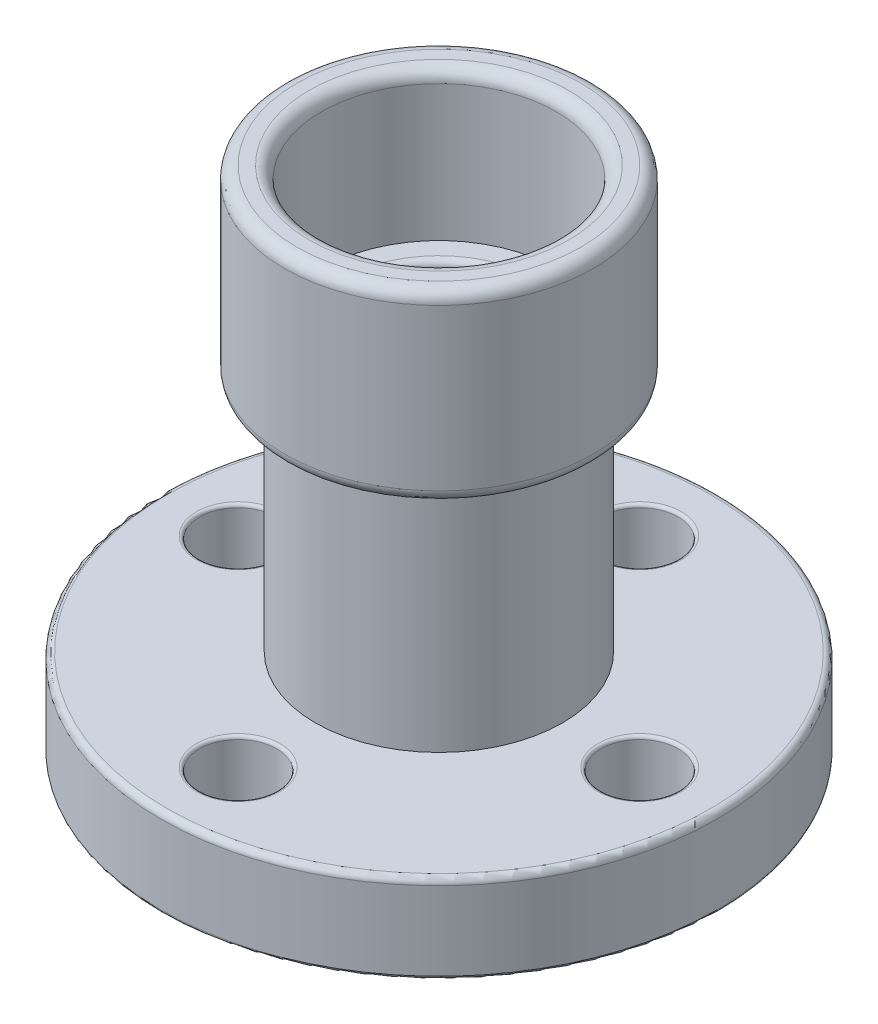
ISO-10303-21;
HEADER;
FILE_DESCRIPTION(('STEP AP214'),'2;1');
FILE_NAME('part.step','',(''),(''),'','','');
FILE_SCHEMA(('AUTOMOTIVE_DESIGN { 1 0 10303 214 1 1 1 1 }'));
ENDSEC;
DATA;
#1=APPLICATION_CONTEXT('core data for automotive mechanical design processes');
#2=APPLICATION_PROTOCOL_DEFINITION('international standard','automotive_design',2000,#1);
#3=PRODUCT_CONTEXT('',#1,'mechanical');
#4=PRODUCT('Part','Part','',(#3));
#5=PRODUCT_RELATED_PRODUCT_CATEGORY('part','',(#4));
#6=PRODUCT_DEFINITION_FORMATION('','',#4);
#7=PRODUCT_DEFINITION_CONTEXT('part definition',#1,'design');
#8=PRODUCT_DEFINITION('design','',#6,#7);
#9=PRODUCT_DEFINITION_SHAPE('','',#8);
#10=(LENGTH_UNIT() NAMED_UNIT(*) SI_UNIT(.MILLI.,.METRE.));
#11=(NAMED_UNIT(*) PLANE_ANGLE_UNIT() SI_UNIT($,.RADIAN.));
#12=(NAMED_UNIT(*) SI_UNIT($,.STERADIAN.) SOLID_ANGLE_UNIT());
#13=UNCERTAINTY_MEASURE_WITH_UNIT(LENGTH_MEASURE(1.E-05),#10,'distance_accuracy_value','');
#14=(GEOMETRIC_REPRESENTATION_CONTEXT(3) GLOBAL_UNCERTAINTY_ASSIGNED_CONTEXT((#13)) GLOBAL_UNIT_ASSIGNED_CONTEXT((#10,
#11,#12)) REPRESENTATION_CONTEXT('',''));
#15=CARTESIAN_POINT('',(0.,0.,0.));
#16=DIRECTION('',(0.,0.,1.));
#17=DIRECTION('',(1.,0.,0.));
#18=AXIS2_PLACEMENT_3D('',#15,#16,#17);
#19=CARTESIAN_POINT('',(0.,44.2,0.));
#20=DIRECTION('',(0.,1.,0.));
#21=DIRECTION('',(0.,0.,1.));
#22=AXIS2_PLACEMENT_3D('',#19,#20,#21);
#23=PLANE('',#22);
#24=CARTESIAN_POINT('',(0.,44.2,0.));
#25=DIRECTION('',(0.,1.,0.));
#26=DIRECTION('',(0.,0.,1.));
#27=AXIS2_PLACEMENT_3D('',#24,#25,#26);
#28=CIRCLE('',#27,16.);
#29=CARTESIAN_POINT('',(0.,44.2,16.));
#30=VERTEX_POINT('',#29);
#31=EDGE_CURVE('E99',#30,#30,#28,.F.);
#32=ORIENTED_EDGE('',*,*,#31,.T.);
#33=EDGE_LOOP('',(#32));
#34=FACE_BOUND('',#33,.T.);
#35=CARTESIAN_POINT('',(0.,44.2,0.));
#36=DIRECTION('',(0.,1.,0.));
#37=DIRECTION('',(0.,0.,1.));
#38=AXIS2_PLACEMENT_3D('',#35,#36,#37);
#39=CIRCLE('',#38,19.);
#40=CARTESIAN_POINT('',(0.,44.2,19.));
#41=VERTEX_POINT('',#40);
#42=EDGE_CURVE('E135',#41,#41,#39,.F.);
#43=ORIENTED_EDGE('',*,*,#42,.F.);
#44=EDGE_LOOP('',(#43));
#45=FACE_BOUND('',#44,.T.);
#46=ADVANCED_FACE('F39',(#34,#45),#23,.T.);
#47=CARTESIAN_POINT('',(0.,-14.2,0.));
#48=DIRECTION('',(0.,1.,0.));
#49=DIRECTION('',(0.,0.,1.));
#50=AXIS2_PLACEMENT_3D('',#47,#48,#49);
#51=CYLINDRICAL_SURFACE('',#50,45.);
#52=CARTESIAN_POINT('',(0.,-13.7,0.));
#53=DIRECTION('',(0.,1.,0.));
#54=DIRECTION('',(0.,0.,1.));
#55=AXIS2_PLACEMENT_3D('',#52,#53,#54);
#56=CIRCLE('',#55,45.);
#57=CARTESIAN_POINT('',(0.,-13.7,45.));
#58=VERTEX_POINT('',#57);
#59=EDGE_CURVE('E57',#58,#58,#56,.T.);
#60=ORIENTED_EDGE('',*,*,#59,.T.);
#61=EDGE_LOOP('',(#60));
#62=FACE_BOUND('',#61,.T.);
#63=CARTESIAN_POINT('',(0.,-0.999999999999999,0.));
#64=DIRECTION('',(0.,1.,0.));
#65=DIRECTION('',(0.,0.,1.));
#66=AXIS2_PLACEMENT_3D('',#63,#64,#65);
#67=CIRCLE('',#66,45.);
#68=CARTESIAN_POINT('',(0.,-0.999999999999999,45.));
#69=VERTEX_POINT('',#68);
#70=EDGE_CURVE('E127',#69,#69,#67,.F.);
#71=ORIENTED_EDGE('',*,*,#70,.T.);
#72=EDGE_LOOP('',(#71));
#73=FACE_BOUND('',#72,.T.);
#74=ADVANCED_FACE('F183',(#62,#73),#51,.T.);
#75=CARTESIAN_POINT('',(0.,-14.2,0.));
#76=DIRECTION('',(0.,1.,0.));
#77=DIRECTION('',(0.,0.,1.));
#78=AXIS2_PLACEMENT_3D('',#75,#76,#77);
#79=CYLINDRICAL_SURFACE('',#78,15.);
#80=CARTESIAN_POINT('',(0.,-13.2,0.));
#81=DIRECTION('',(0.,1.,0.));
#82=DIRECTION('',(0.,0.,1.));
#83=AXIS2_PLACEMENT_3D('',#80,#81,#82);
#84=CIRCLE('',#83,15.);
#85=CARTESIAN_POINT('',(0.,-13.2,15.));
#86=VERTEX_POINT('',#85);
#87=EDGE_CURVE('E10',#86,#86,#84,.F.);
#88=ORIENTED_EDGE('',*,*,#87,.T.);
#89=EDGE_LOOP('',(#88));
#90=FACE_BOUND('',#89,.T.);
#91=CARTESIAN_POINT('',(0.,43.2,0.));
#92=DIRECTION('',(0.,1.,0.));
#93=DIRECTION('',(0.,0.,1.));
#94=AXIS2_PLACEMENT_3D('',#91,#92,#93);
#95=CIRCLE('',#94,15.);
#96=CARTESIAN_POINT('',(0.,43.2,15.));
#97=VERTEX_POINT('',#96);
#98=EDGE_CURVE('E95',#97,#97,#95,.T.);
#99=ORIENTED_EDGE('',*,*,#98,.T.);
#100=EDGE_LOOP('',(#99));
#101=FACE_BOUND('',#100,.T.);
#102=ADVANCED_FACE('F189',(#90,#101),#79,.F.);
#103=CARTESIAN_POINT('',(0.,-14.2,0.));
#104=DIRECTION('',(0.,1.,0.));
#105=DIRECTION('',(0.,0.,1.));
#106=AXIS2_PLACEMENT_3D('',#103,#104,#105);
#107=PLANE('',#106);
#108=CARTESIAN_POINT('',(0.,-14.2,0.));
#109=DIRECTION('',(0.,1.,0.));
#110=DIRECTION('',(0.,0.,1.));
#111=AXIS2_PLACEMENT_3D('',#108,#109,#110);
#112=CIRCLE('',#111,16.);
#113=CARTESIAN_POINT('',(0.,-14.2,16.));
#114=VERTEX_POINT('',#113);
#115=EDGE_CURVE('E47',#114,#114,#112,.T.);
#116=ORIENTED_EDGE('',*,*,#115,.T.);
#117=EDGE_LOOP('',(#116));
#118=FACE_BOUND('',#117,.T.);
#119=CARTESIAN_POINT('',(0.,-14.2,0.));
#120=DIRECTION('',(0.,1.,0.));
#121=DIRECTION('',(0.,0.,1.));
#122=AXIS2_PLACEMENT_3D('',#119,#120,#121);
#123=CIRCLE('',#122,44.5);
#124=CARTESIAN_POINT('',(0.,-14.2,44.5));
#125=VERTEX_POINT('',#124);
#126=EDGE_CURVE('E52',#125,#125,#123,.F.);
#127=ORIENTED_EDGE('',*,*,#126,.T.);
#128=EDGE_LOOP('',(#127));
#129=FACE_BOUND('',#128,.T.);
#130=CARTESIAN_POINT('',(0.,-14.2,-32.5));
#131=DIRECTION('',(0.,1.,0.));
#132=DIRECTION('',(0.,0.,1.));
#133=AXIS2_PLACEMENT_3D('',#130,#131,#132);
#134=CIRCLE('',#133,6.25);
#135=CARTESIAN_POINT('',(0.,-14.2,-26.25));
#136=VERTEX_POINT('',#135);
#137=EDGE_CURVE('E141',#136,#136,#134,.T.);
#138=ORIENTED_EDGE('',*,*,#137,.T.);
#139=EDGE_LOOP('',(#138));
#140=FACE_BOUND('',#139,.T.);
#141=CARTESIAN_POINT('',(32.5,-14.2,1.23857817503888E-13));
#142=DIRECTION('',(0.,1.,0.));
#143=DIRECTION('',(0.,0.,1.));
#144=AXIS2_PLACEMENT_3D('',#141,#142,#143);
#145=CIRCLE('',#144,6.25);
#146=CARTESIAN_POINT('',(32.5,-14.2,6.25000000000012));
#147=VERTEX_POINT('',#146);
#148=EDGE_CURVE('E151',#147,#147,#145,.T.);
#149=ORIENTED_EDGE('',*,*,#148,.T.);
#150=EDGE_LOOP('',(#149));
#151=FACE_BOUND('',#150,.T.);
#152=CARTESIAN_POINT('',(1.83891658677215E-12,-14.2,32.5));
#153=DIRECTION('',(0.,1.,0.));
#154=DIRECTION('',(0.,0.,1.));
#155=AXIS2_PLACEMENT_3D('',#152,#153,#154);
#156=CIRCLE('',#155,6.25000000000198);
#157=CARTESIAN_POINT('',(1.83891658677215E-12,-14.2,38.750000000002));
#158=VERTEX_POINT('',#157);
#159=EDGE_CURVE('E155',#158,#158,#156,.T.);
#160=ORIENTED_EDGE('',*,*,#159,.T.);
#161=EDGE_LOOP('',(#160));
#162=FACE_BOUND('',#161,.T.);
#163=CARTESIAN_POINT('',(-32.5,-14.2,-3.50804104528691E-13));
#164=DIRECTION('',(0.,1.,0.));
#165=DIRECTION('',(0.,0.,1.));
#166=AXIS2_PLACEMENT_3D('',#163,#164,#165);
#167=CIRCLE('',#166,6.25);
#168=CARTESIAN_POINT('',(-32.5,-14.2,6.24999999999965));
#169=VERTEX_POINT('',#168);
#170=EDGE_CURVE('E159',#169,#169,#167,.T.);
#171=ORIENTED_EDGE('',*,*,#170,.T.);
#172=EDGE_LOOP('',(#171));
#173=FACE_BOUND('',#172,.T.);
#174=ADVANCED_FACE('F164',(#118,#129,#140,#151,#162,#173),#107,.F.);
#175=CARTESIAN_POINT('',(0.,0.,0.));
#176=DIRECTION('',(0.,1.,0.));
#177=DIRECTION('',(0.,0.,1.));
#178=AXIS2_PLACEMENT_3D('',#175,#176,#177);
#179=PLANE('',#178);
#180=CARTESIAN_POINT('',(0.,0.,-32.5));
#181=DIRECTION('',(0.,1.,0.));
#182=DIRECTION('',(0.,0.,1.));
#183=AXIS2_PLACEMENT_3D('',#180,#181,#182);
#184=CIRCLE('',#183,6.75);
#185=CARTESIAN_POINT('',(0.,0.,-25.75));
#186=VERTEX_POINT('',#185);
#187=EDGE_CURVE('E75',#186,#186,#184,.F.);
#188=ORIENTED_EDGE('',*,*,#187,.T.);
#189=EDGE_LOOP('',(#188));
#190=FACE_BOUND('',#189,.T.);
#191=CARTESIAN_POINT('',(32.5,0.,1.23857817503888E-13));
#192=DIRECTION('',(0.,1.,0.));
#193=DIRECTION('',(0.,0.,1.));
#194=AXIS2_PLACEMENT_3D('',#191,#192,#193);
#195=CIRCLE('',#194,6.75);
#196=CARTESIAN_POINT('',(32.5,0.,6.75000000000012));
#197=VERTEX_POINT('',#196);
#198=EDGE_CURVE('E79',#197,#197,#195,.F.);
#199=ORIENTED_EDGE('',*,*,#198,.T.);
#200=EDGE_LOOP('',(#199));
#201=FACE_BOUND('',#200,.T.);
#202=CARTESIAN_POINT('',(-32.5,0.,-3.50804104528691E-13));
#203=DIRECTION('',(0.,1.,0.));
#204=DIRECTION('',(0.,0.,1.));
#205=AXIS2_PLACEMENT_3D('',#202,#203,#204);
#206=CIRCLE('',#205,6.75);
#207=CARTESIAN_POINT('',(-32.5,0.,6.74999999999965));
#208=VERTEX_POINT('',#207);
#209=EDGE_CURVE('E83',#208,#208,#206,.F.);
#210=ORIENTED_EDGE('',*,*,#209,.T.);
#211=EDGE_LOOP('',(#210));
#212=FACE_BOUND('',#211,.T.);
#213=CARTESIAN_POINT('',(1.83891658677215E-12,0.,32.5));
#214=DIRECTION('',(0.,1.,0.));
#215=DIRECTION('',(0.,0.,1.));
#216=AXIS2_PLACEMENT_3D('',#213,#214,#215);
#217=CIRCLE('',#216,6.75000000000198);
#218=CARTESIAN_POINT('',(1.83891658677215E-12,0.,39.250000000002));
#219=VERTEX_POINT('',#218);
#220=EDGE_CURVE('E87',#219,#219,#217,.F.);
#221=ORIENTED_EDGE('',*,*,#220,.T.);
#222=EDGE_LOOP('',(#221));
#223=FACE_BOUND('',#222,.T.);
#224=CARTESIAN_POINT('',(0.,0.,0.));
#225=DIRECTION('',(0.,1.,0.));
#226=DIRECTION('',(0.,0.,1.));
#227=AXIS2_PLACEMENT_3D('',#224,#225,#226);
#228=CIRCLE('',#227,44.);
#229=CARTESIAN_POINT('',(0.,0.,44.));
#230=VERTEX_POINT('',#229);
#231=EDGE_CURVE('E131',#230,#230,#228,.T.);
#232=ORIENTED_EDGE('',*,*,#231,.T.);
#233=EDGE_LOOP('',(#232));
#234=FACE_BOUND('',#233,.T.);
#235=CARTESIAN_POINT('',(0.,0.,0.));
#236=DIRECTION('',(0.,1.,0.));
#237=DIRECTION('',(0.,0.,1.));
#238=AXIS2_PLACEMENT_3D('',#235,#236,#237);
#239=CIRCLE('',#238,20.);
#240=CARTESIAN_POINT('',(0.,0.,20.));
#241=VERTEX_POINT('',#240);
#242=EDGE_CURVE('E140',#241,#241,#239,.T.);
#243=ORIENTED_EDGE('',*,*,#242,.F.);
#244=EDGE_LOOP('',(#243));
#245=FACE_BOUND('',#244,.T.);
#246=ADVANCED_FACE('F200',(#190,#201,#212,#223,#234,#245),#179,.T.);
#247=CARTESIAN_POINT('',(0.,44.2,0.));
#248=DIRECTION('',(0.,-1.,0.));
#249=DIRECTION('',(0.,0.,-1.));
#250=AXIS2_PLACEMENT_3D('',#247,#248,#249);
#251=CYLINDRICAL_SURFACE('',#250,20.);
#252=CARTESIAN_POINT('',(0.,38.2,0.));
#253=DIRECTION('',(0.,-1.,0.));
#254=DIRECTION('',(0.,0.,-1.));
#255=AXIS2_PLACEMENT_3D('',#252,#253,#254);
#256=CIRCLE('',#255,20.);
#257=CARTESIAN_POINT('',(0.,38.2,-20.));
#258=VERTEX_POINT('',#257);
#259=EDGE_CURVE('E136',#258,#258,#256,.T.);
#260=ORIENTED_EDGE('',*,*,#259,.T.);
#261=EDGE_LOOP('',(#260));
#262=FACE_BOUND('',#261,.T.);
#263=ORIENTED_EDGE('',*,*,#242,.T.);
#264=EDGE_LOOP('',(#263));
#265=FACE_BOUND('',#264,.T.);
#266=ADVANCED_FACE('F197',(#262,#265),#251,.T.);
#267=CARTESIAN_POINT('',(0.,68.2,0.));
#268=DIRECTION('',(0.,-1.,0.));
#269=DIRECTION('',(0.,0.,-1.));
#270=AXIS2_PLACEMENT_3D('',#267,#268,#269);
#271=CYLINDRICAL_SURFACE('',#270,19.);
#272=CARTESIAN_POINT('',(0.,66.2,0.));
#273=DIRECTION('',(0.,1.,0.));
#274=DIRECTION('',(0.,0.,1.));
#275=AXIS2_PLACEMENT_3D('',#272,#273,#274);
#276=CIRCLE('',#275,19.);
#277=CARTESIAN_POINT('',(0.,66.2,19.));
#278=VERTEX_POINT('',#277);
#279=EDGE_CURVE('E103',#278,#278,#276,.T.);
#280=ORIENTED_EDGE('',*,*,#279,.T.);
#281=EDGE_LOOP('',(#280));
#282=FACE_BOUND('',#281,.T.);
#283=ORIENTED_EDGE('',*,*,#42,.T.);
#284=EDGE_LOOP('',(#283));
#285=FACE_BOUND('',#284,.T.);
#286=ADVANCED_FACE('F195',(#282,#285),#271,.F.);
#287=CARTESIAN_POINT('',(0.,68.2,0.));
#288=DIRECTION('',(0.,-1.,0.));
#289=DIRECTION('',(0.,0.,-1.));
#290=AXIS2_PLACEMENT_3D('',#287,#288,#289);
#291=CYLINDRICAL_SURFACE('',#290,25.);
#292=CARTESIAN_POINT('',(0.,40.2,0.));
#293=DIRECTION('',(0.,-1.,0.));
#294=DIRECTION('',(0.,0.,-1.));
#295=AXIS2_PLACEMENT_3D('',#292,#293,#294);
#296=CIRCLE('',#295,25.);
#297=CARTESIAN_POINT('',(0.,40.2,-25.));
#298=VERTEX_POINT('',#297);
#299=EDGE_CURVE('E115',#298,#298,#296,.F.);
#300=ORIENTED_EDGE('',*,*,#299,.T.);
#301=EDGE_LOOP('',(#300));
#302=FACE_BOUND('',#301,.T.);
#303=CARTESIAN_POINT('',(0.,66.2,0.));
#304=DIRECTION('',(0.,1.,0.));
#305=DIRECTION('',(0.,0.,1.));
#306=AXIS2_PLACEMENT_3D('',#303,#304,#305);
#307=CIRCLE('',#306,25.);
#308=CARTESIAN_POINT('',(0.,66.2,25.));
#309=VERTEX_POINT('',#308);
#310=EDGE_CURVE('E119',#309,#309,#307,.F.);
#311=ORIENTED_EDGE('',*,*,#310,.T.);
#312=EDGE_LOOP('',(#311));
#313=FACE_BOUND('',#312,.T.);
#314=ADVANCED_FACE('F372',(#302,#313),#291,.T.);
#315=CARTESIAN_POINT('',(0.,68.2,0.));
#316=DIRECTION('',(0.,1.,0.));
#317=DIRECTION('',(0.,0.,1.));
#318=AXIS2_PLACEMENT_3D('',#315,#316,#317);
#319=PLANE('',#318);
#320=CARTESIAN_POINT('',(0.,68.2,0.));
#321=DIRECTION('',(0.,1.,0.));
#322=DIRECTION('',(0.,0.,1.));
#323=AXIS2_PLACEMENT_3D('',#320,#321,#322);
#324=CIRCLE('',#323,23.);
#325=CARTESIAN_POINT('',(0.,68.2,23.));
#326=VERTEX_POINT('',#325);
#327=EDGE_CURVE('E107',#326,#326,#324,.T.);
#328=ORIENTED_EDGE('',*,*,#327,.T.);
#329=EDGE_LOOP('',(#328));
#330=FACE_BOUND('',#329,.T.);
#331=CARTESIAN_POINT('',(0.,68.2,0.));
#332=DIRECTION('',(0.,1.,0.));
#333=DIRECTION('',(0.,0.,1.));
#334=AXIS2_PLACEMENT_3D('',#331,#332,#333);
#335=CIRCLE('',#334,21.);
#336=CARTESIAN_POINT('',(0.,68.2,21.));
#337=VERTEX_POINT('',#336);
#338=EDGE_CURVE('E111',#337,#337,#335,.F.);
#339=ORIENTED_EDGE('',*,*,#338,.T.);
#340=EDGE_LOOP('',(#339));
#341=FACE_BOUND('',#340,.T.);
#342=ADVANCED_FACE('F179',(#330,#341),#319,.T.);
#343=CARTESIAN_POINT('',(0.,38.2,0.));
#344=DIRECTION('',(0.,-1.,0.));
#345=DIRECTION('',(0.,0.,-1.));
#346=AXIS2_PLACEMENT_3D('',#343,#344,#345);
#347=PLANE('',#346);
#348=CARTESIAN_POINT('',(0.,38.2,0.));
#349=DIRECTION('',(0.,-1.,0.));
#350=DIRECTION('',(0.,0.,-1.));
#351=AXIS2_PLACEMENT_3D('',#348,#349,#350);
#352=CIRCLE('',#351,23.);
#353=CARTESIAN_POINT('',(0.,38.2,-23.));
#354=VERTEX_POINT('',#353);
#355=EDGE_CURVE('E123',#354,#354,#352,.T.);
#356=ORIENTED_EDGE('',*,*,#355,.T.);
#357=EDGE_LOOP('',(#356));
#358=FACE_BOUND('',#357,.T.);
#359=ORIENTED_EDGE('',*,*,#259,.F.);
#360=EDGE_LOOP('',(#359));
#361=FACE_BOUND('',#360,.T.);
#362=ADVANCED_FACE('F169',(#358,#361),#347,.T.);
#363=CARTESIAN_POINT('',(-32.5,-24.,-3.50804104528691E-13));
#364=DIRECTION('',(0.,1.,0.));
#365=DIRECTION('',(0.,0.,1.));
#366=AXIS2_PLACEMENT_3D('',#363,#364,#365);
#367=CYLINDRICAL_SURFACE('',#366,6.25);
#368=CARTESIAN_POINT('',(-32.5,-0.5,-3.50804104528691E-13));
#369=DIRECTION('',(0.,1.,0.));
#370=DIRECTION('',(0.,0.,1.));
#371=AXIS2_PLACEMENT_3D('',#368,#369,#370);
#372=CIRCLE('',#371,6.25);
#373=CARTESIAN_POINT('',(-32.5,-0.5,6.24999999999965));
#374=VERTEX_POINT('',#373);
#375=EDGE_CURVE('E67',#374,#374,#372,.T.);
#376=ORIENTED_EDGE('',*,*,#375,.T.);
#377=EDGE_LOOP('',(#376));
#378=FACE_BOUND('',#377,.T.);
#379=ORIENTED_EDGE('',*,*,#170,.F.);
#380=EDGE_LOOP('',(#379));
#381=FACE_BOUND('',#380,.T.);
#382=ADVANCED_FACE('F166',(#378,#381),#367,.F.);
#383=CARTESIAN_POINT('',(1.83891658677215E-12,-24.,32.5));
#384=DIRECTION('',(0.,1.,0.));
#385=DIRECTION('',(0.,0.,1.));
#386=AXIS2_PLACEMENT_3D('',#383,#384,#385);
#387=CYLINDRICAL_SURFACE('',#386,6.25000000000198);
#388=CARTESIAN_POINT('',(1.83891658677215E-12,-0.5,32.5));
#389=DIRECTION('',(0.,1.,0.));
#390=DIRECTION('',(0.,0.,1.));
#391=AXIS2_PLACEMENT_3D('',#388,#389,#390);
#392=CIRCLE('',#391,6.25000000000198);
#393=CARTESIAN_POINT('',(1.83891658677215E-12,-0.5,38.750000000002));
#394=VERTEX_POINT('',#393);
#395=EDGE_CURVE('E63',#394,#394,#392,.T.);
#396=ORIENTED_EDGE('',*,*,#395,.T.);
#397=EDGE_LOOP('',(#396));
#398=FACE_BOUND('',#397,.T.);
#399=ORIENTED_EDGE('',*,*,#159,.F.);
#400=EDGE_LOOP('',(#399));
#401=FACE_BOUND('',#400,.T.);
#402=ADVANCED_FACE('F168',(#398,#401),#387,.F.);
#403=CARTESIAN_POINT('',(32.5,-24.,1.23857817503888E-13));
#404=DIRECTION('',(0.,1.,0.));
#405=DIRECTION('',(0.,0.,1.));
#406=AXIS2_PLACEMENT_3D('',#403,#404,#405);
#407=CYLINDRICAL_SURFACE('',#406,6.25);
#408=CARTESIAN_POINT('',(32.5,-0.5,1.23857817503888E-13));
#409=DIRECTION('',(0.,1.,0.));
#410=DIRECTION('',(0.,0.,1.));
#411=AXIS2_PLACEMENT_3D('',#408,#409,#410);
#412=CIRCLE('',#411,6.25);
#413=CARTESIAN_POINT('',(32.5,-0.5,6.25000000000012));
#414=VERTEX_POINT('',#413);
#415=EDGE_CURVE('E71',#414,#414,#412,.T.);
#416=ORIENTED_EDGE('',*,*,#415,.T.);
#417=EDGE_LOOP('',(#416));
#418=FACE_BOUND('',#417,.T.);
#419=ORIENTED_EDGE('',*,*,#148,.F.);
#420=EDGE_LOOP('',(#419));
#421=FACE_BOUND('',#420,.T.);
#422=ADVANCED_FACE('F176',(#418,#421),#407,.F.);
#423=CARTESIAN_POINT('',(0.,-24.,-32.5));
#424=DIRECTION('',(0.,1.,0.));
#425=DIRECTION('',(0.,0.,1.));
#426=AXIS2_PLACEMENT_3D('',#423,#424,#425);
#427=CYLINDRICAL_SURFACE('',#426,6.25);
#428=CARTESIAN_POINT('',(0.,-0.5,-32.5));
#429=DIRECTION('',(0.,1.,0.));
#430=DIRECTION('',(0.,0.,1.));
#431=AXIS2_PLACEMENT_3D('',#428,#429,#430);
#432=CIRCLE('',#431,6.25);
#433=CARTESIAN_POINT('',(0.,-0.5,-26.25));
#434=VERTEX_POINT('',#433);
#435=EDGE_CURVE('E91',#434,#434,#432,.T.);
#436=ORIENTED_EDGE('',*,*,#435,.T.);
#437=EDGE_LOOP('',(#436));
#438=FACE_BOUND('',#437,.T.);
#439=ORIENTED_EDGE('',*,*,#137,.F.);
#440=EDGE_LOOP('',(#439));
#441=FACE_BOUND('',#440,.T.);
#442=ADVANCED_FACE('F213',(#438,#441),#427,.F.);
#443=CARTESIAN_POINT('',(0.,-0.999999999999999,0.));
#444=DIRECTION('',(0.,1.,0.));
#445=DIRECTION('',(0.,0.,1.));
#446=AXIS2_PLACEMENT_3D('',#443,#444,#445);
#447=TOROIDAL_SURFACE('',#446,44.,1.);
#448=ORIENTED_EDGE('',*,*,#70,.F.);
#449=EDGE_LOOP('',(#448));
#450=FACE_BOUND('',#449,.T.);
#451=ORIENTED_EDGE('',*,*,#231,.F.);
#452=EDGE_LOOP('',(#451));
#453=FACE_BOUND('',#452,.T.);
#454=ADVANCED_FACE('F209',(#450,#453),#447,.T.);
#455=CARTESIAN_POINT('',(0.,40.2,0.));
#456=DIRECTION('',(0.,-1.,0.));
#457=DIRECTION('',(0.,0.,-1.));
#458=AXIS2_PLACEMENT_3D('',#455,#456,#457);
#459=TOROIDAL_SURFACE('',#458,23.,2.);
#460=ORIENTED_EDGE('',*,*,#299,.F.);
#461=EDGE_LOOP('',(#460));
#462=FACE_BOUND('',#461,.T.);
#463=ORIENTED_EDGE('',*,*,#355,.F.);
#464=EDGE_LOOP('',(#463));
#465=FACE_BOUND('',#464,.T.);
#466=ADVANCED_FACE('F212',(#462,#465),#459,.T.);
#467=CARTESIAN_POINT('',(0.,66.2,0.));
#468=DIRECTION('',(0.,1.,0.));
#469=DIRECTION('',(0.,0.,1.));
#470=AXIS2_PLACEMENT_3D('',#467,#468,#469);
#471=TOROIDAL_SURFACE('',#470,23.,2.);
#472=ORIENTED_EDGE('',*,*,#310,.F.);
#473=EDGE_LOOP('',(#472));
#474=FACE_BOUND('',#473,.T.);
#475=ORIENTED_EDGE('',*,*,#327,.F.);
#476=EDGE_LOOP('',(#475));
#477=FACE_BOUND('',#476,.T.);
#478=ADVANCED_FACE('F217',(#474,#477),#471,.T.);
#479=CARTESIAN_POINT('',(0.,66.2,0.));
#480=DIRECTION('',(0.,1.,0.));
#481=DIRECTION('',(0.,0.,1.));
#482=AXIS2_PLACEMENT_3D('',#479,#480,#481);
#483=TOROIDAL_SURFACE('',#482,21.,2.);
#484=ORIENTED_EDGE('',*,*,#338,.F.);
#485=EDGE_LOOP('',(#484));
#486=FACE_BOUND('',#485,.T.);
#487=ORIENTED_EDGE('',*,*,#279,.F.);
#488=EDGE_LOOP('',(#487));
#489=FACE_BOUND('',#488,.T.);
#490=ADVANCED_FACE('F221',(#486,#489),#483,.T.);
#491=CARTESIAN_POINT('',(0.,43.2,0.));
#492=DIRECTION('',(0.,1.,0.));
#493=DIRECTION('',(0.,0.,1.));
#494=AXIS2_PLACEMENT_3D('',#491,#492,#493);
#495=TOROIDAL_SURFACE('',#494,16.,1.);
#496=ORIENTED_EDGE('',*,*,#98,.F.);
#497=EDGE_LOOP('',(#496));
#498=FACE_BOUND('',#497,.T.);
#499=ORIENTED_EDGE('',*,*,#31,.F.);
#500=EDGE_LOOP('',(#499));
#501=FACE_BOUND('',#500,.T.);
#502=ADVANCED_FACE('F225',(#498,#501),#495,.T.);
#503=CARTESIAN_POINT('',(0.,-0.5,-32.5));
#504=DIRECTION('',(0.,1.,0.));
#505=DIRECTION('',(0.,0.,1.));
#506=AXIS2_PLACEMENT_3D('',#503,#504,#505);
#507=TOROIDAL_SURFACE('',#506,6.75,0.5);
#508=ORIENTED_EDGE('',*,*,#187,.F.);
#509=EDGE_LOOP('',(#508));
#510=FACE_BOUND('',#509,.T.);
#511=ORIENTED_EDGE('',*,*,#435,.F.);
#512=EDGE_LOOP('',(#511));
#513=FACE_BOUND('',#512,.T.);
#514=ADVANCED_FACE('F229',(#510,#513),#507,.T.);
#515=CARTESIAN_POINT('',(32.5,-0.5,1.23857817503888E-13));
#516=DIRECTION('',(0.,1.,0.));
#517=DIRECTION('',(0.,0.,1.));
#518=AXIS2_PLACEMENT_3D('',#515,#516,#517);
#519=TOROIDAL_SURFACE('',#518,6.75,0.5);
#520=ORIENTED_EDGE('',*,*,#198,.F.);
#521=EDGE_LOOP('',(#520));
#522=FACE_BOUND('',#521,.T.);
#523=ORIENTED_EDGE('',*,*,#415,.F.);
#524=EDGE_LOOP('',(#523));
#525=FACE_BOUND('',#524,.T.);
#526=ADVANCED_FACE('F233',(#522,#525),#519,.T.);
#527=CARTESIAN_POINT('',(-32.5,-0.5,-3.50804104528691E-13));
#528=DIRECTION('',(0.,1.,0.));
#529=DIRECTION('',(0.,0.,1.));
#530=AXIS2_PLACEMENT_3D('',#527,#528,#529);
#531=TOROIDAL_SURFACE('',#530,6.75,0.5);
#532=ORIENTED_EDGE('',*,*,#209,.F.);
#533=EDGE_LOOP('',(#532));
#534=FACE_BOUND('',#533,.T.);
#535=ORIENTED_EDGE('',*,*,#375,.F.);
#536=EDGE_LOOP('',(#535));
#537=FACE_BOUND('',#536,.T.);
#538=ADVANCED_FACE('F237',(#534,#537),#531,.T.);
#539=CARTESIAN_POINT('',(1.83891658677215E-12,-0.5,32.5));
#540=DIRECTION('',(0.,1.,0.));
#541=DIRECTION('',(0.,0.,1.));
#542=AXIS2_PLACEMENT_3D('',#539,#540,#541);
#543=TOROIDAL_SURFACE('',#542,6.75000000000198,0.5);
#544=ORIENTED_EDGE('',*,*,#220,.F.);
#545=EDGE_LOOP('',(#544));
#546=FACE_BOUND('',#545,.T.);
#547=ORIENTED_EDGE('',*,*,#395,.F.);
#548=EDGE_LOOP('',(#547));
#549=FACE_BOUND('',#548,.T.);
#550=ADVANCED_FACE('F241',(#546,#549),#543,.T.);
#551=CARTESIAN_POINT('',(0.,-13.7,0.));
#552=DIRECTION('',(0.,1.,0.));
#553=DIRECTION('',(0.,0.,1.));
#554=AXIS2_PLACEMENT_3D('',#551,#552,#553);
#555=TOROIDAL_SURFACE('',#554,44.5,0.5);
#556=ORIENTED_EDGE('',*,*,#126,.F.);
#557=EDGE_LOOP('',(#556));
#558=FACE_BOUND('',#557,.T.);
#559=ORIENTED_EDGE('',*,*,#59,.F.);
#560=EDGE_LOOP('',(#559));
#561=FACE_BOUND('',#560,.T.);
#562=ADVANCED_FACE('F244',(#558,#561),#555,.T.);
#563=CARTESIAN_POINT('',(0.,-13.2,0.));
#564=DIRECTION('',(0.,1.,0.));
#565=DIRECTION('',(0.,0.,1.));
#566=AXIS2_PLACEMENT_3D('',#563,#564,#565);
#567=TOROIDAL_SURFACE('',#566,16.,1.);
#568=ORIENTED_EDGE('',*,*,#87,.F.);
#569=EDGE_LOOP('',(#568));
#570=FACE_BOUND('',#569,.T.);
#571=ORIENTED_EDGE('',*,*,#115,.F.);
#572=EDGE_LOOP('',(#571));
#573=FACE_BOUND('',#572,.T.);
#574=ADVANCED_FACE('F41',(#570,#573),#567,.T.);
#575=CLOSED_SHELL('',(#46,#74,#102,#174,#246,#266,#286,#314,#342,#362,#382,#402,#422,#442,#454,
#466,#478,#490,#502,#514,#526,#538,#550,#562,#574));
#576=MANIFOLD_SOLID_BREP('B2',#575);
#577=ADVANCED_BREP_SHAPE_REPRESENTATION('',(#18,#576),#14);
#578=SHAPE_DEFINITION_REPRESENTATION(#9,#577);
ENDSEC;
END-ISO-10303-21;
